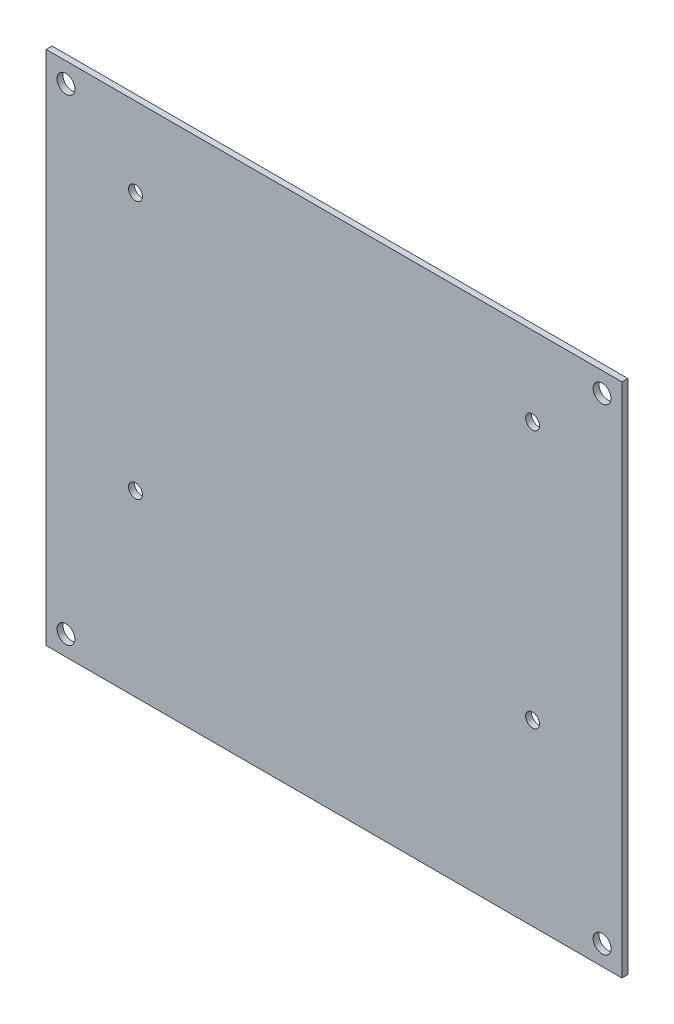
ISO-10303-21;
HEADER;
FILE_DESCRIPTION(('STEP AP214'),'2;1');
FILE_NAME('part.step','',(''),(''),'','','');
FILE_SCHEMA(('AUTOMOTIVE_DESIGN { 1 0 10303 214 1 1 1 1 }'));
ENDSEC;
DATA;
#1=APPLICATION_CONTEXT('core data for automotive mechanical design processes');
#2=APPLICATION_PROTOCOL_DEFINITION('international standard','automotive_design',2000,#1);
#3=PRODUCT_CONTEXT('',#1,'mechanical');
#4=PRODUCT('Part','Part','',(#3));
#5=PRODUCT_RELATED_PRODUCT_CATEGORY('part','',(#4));
#6=PRODUCT_DEFINITION_FORMATION('','',#4);
#7=PRODUCT_DEFINITION_CONTEXT('part definition',#1,'design');
#8=PRODUCT_DEFINITION('design','',#6,#7);
#9=PRODUCT_DEFINITION_SHAPE('','',#8);
#10=(LENGTH_UNIT() NAMED_UNIT(*) SI_UNIT(.MILLI.,.METRE.));
#11=(NAMED_UNIT(*) PLANE_ANGLE_UNIT() SI_UNIT($,.RADIAN.));
#12=(NAMED_UNIT(*) SI_UNIT($,.STERADIAN.) SOLID_ANGLE_UNIT());
#13=UNCERTAINTY_MEASURE_WITH_UNIT(LENGTH_MEASURE(1.E-05),#10,'distance_accuracy_value','');
#14=(GEOMETRIC_REPRESENTATION_CONTEXT(3) GLOBAL_UNCERTAINTY_ASSIGNED_CONTEXT((#13)) GLOBAL_UNIT_ASSIGNED_CONTEXT((#10,
#11,#12)) REPRESENTATION_CONTEXT('',''));
#15=CARTESIAN_POINT('',(0.,0.,0.));
#16=DIRECTION('',(0.,0.,1.));
#17=DIRECTION('',(1.,0.,0.));
#18=AXIS2_PLACEMENT_3D('',#15,#16,#17);
#19=CARTESIAN_POINT('',(-72.5,-65.,1.5));
#20=DIRECTION('',(0.,0.,-1.));
#21=DIRECTION('',(-1.,0.,0.));
#22=AXIS2_PLACEMENT_3D('',#19,#20,#21);
#23=PLANE('',#22);
#24=CARTESIAN_POINT('',(50.,45.,1.5));
#25=DIRECTION('',(0.,0.,1.));
#26=DIRECTION('',(1.,0.,0.));
#27=AXIS2_PLACEMENT_3D('',#24,#25,#26);
#28=CIRCLE('',#27,1.75);
#29=CARTESIAN_POINT('',(51.75,45.,1.5));
#30=VERTEX_POINT('',#29);
#31=EDGE_CURVE('E143',#30,#30,#28,.T.);
#32=ORIENTED_EDGE('',*,*,#31,.F.);
#33=EDGE_LOOP('',(#32));
#34=FACE_BOUND('',#33,.T.);
#35=CARTESIAN_POINT('',(-50.,45.,1.5));
#36=DIRECTION('',(0.,0.,1.));
#37=DIRECTION('',(1.,0.,0.));
#38=AXIS2_PLACEMENT_3D('',#35,#36,#37);
#39=CIRCLE('',#38,1.75);
#40=CARTESIAN_POINT('',(-48.25,45.,1.5));
#41=VERTEX_POINT('',#40);
#42=EDGE_CURVE('E131',#41,#41,#39,.T.);
#43=ORIENTED_EDGE('',*,*,#42,.F.);
#44=EDGE_LOOP('',(#43));
#45=FACE_BOUND('',#44,.T.);
#46=CARTESIAN_POINT('',(67.5,-60.,1.5));
#47=DIRECTION('',(0.,0.,1.));
#48=DIRECTION('',(1.,0.,0.));
#49=AXIS2_PLACEMENT_3D('',#46,#47,#48);
#50=CIRCLE('',#49,2.25);
#51=CARTESIAN_POINT('',(69.75,-60.,1.5));
#52=VERTEX_POINT('',#51);
#53=EDGE_CURVE('E119',#52,#52,#50,.T.);
#54=ORIENTED_EDGE('',*,*,#53,.F.);
#55=EDGE_LOOP('',(#54));
#56=FACE_BOUND('',#55,.T.);
#57=CARTESIAN_POINT('',(-67.5,60.,1.5));
#58=DIRECTION('',(0.,0.,1.));
#59=DIRECTION('',(1.,0.,0.));
#60=AXIS2_PLACEMENT_3D('',#57,#58,#59);
#61=CIRCLE('',#60,2.25);
#62=CARTESIAN_POINT('',(-65.25,60.,1.5));
#63=VERTEX_POINT('',#62);
#64=EDGE_CURVE('E98',#63,#63,#61,.T.);
#65=ORIENTED_EDGE('',*,*,#64,.F.);
#66=EDGE_LOOP('',(#65));
#67=FACE_BOUND('',#66,.T.);
#68=DIRECTION('',(0.,-1.,0.));
#69=VECTOR('',#68,1.);
#70=CARTESIAN_POINT('',(-72.5,-65.,1.5));
#71=LINE('',#70,#69);
#72=CARTESIAN_POINT('',(-72.5,65.,1.5));
#73=VERTEX_POINT('',#72);
#74=CARTESIAN_POINT('',(-72.5,-65.,1.5));
#75=VERTEX_POINT('',#74);
#76=EDGE_CURVE('E83',#73,#75,#71,.T.);
#77=ORIENTED_EDGE('',*,*,#76,.T.);
#78=DIRECTION('',(1.,0.,0.));
#79=VECTOR('',#78,1.);
#80=CARTESIAN_POINT('',(-72.5,-65.,1.5));
#81=LINE('',#80,#79);
#82=CARTESIAN_POINT('',(72.5,-65.,1.5));
#83=VERTEX_POINT('',#82);
#84=EDGE_CURVE('E78',#75,#83,#81,.T.);
#85=ORIENTED_EDGE('',*,*,#84,.T.);
#86=DIRECTION('',(0.,1.,0.));
#87=VECTOR('',#86,1.);
#88=CARTESIAN_POINT('',(72.5,-65.,1.5));
#89=LINE('',#88,#87);
#90=CARTESIAN_POINT('',(72.5,65.,1.5));
#91=VERTEX_POINT('',#90);
#92=EDGE_CURVE('E81',#83,#91,#89,.T.);
#93=ORIENTED_EDGE('',*,*,#92,.T.);
#94=DIRECTION('',(-1.,0.,0.));
#95=VECTOR('',#94,1.);
#96=CARTESIAN_POINT('',(-72.5,65.,1.5));
#97=LINE('',#96,#95);
#98=EDGE_CURVE('E48',#91,#73,#97,.T.);
#99=ORIENTED_EDGE('',*,*,#98,.T.);
#100=EDGE_LOOP('',(#77,#85,#93,#99));
#101=FACE_BOUND('',#100,.T.);
#102=CARTESIAN_POINT('',(-67.5,-60.,1.5));
#103=DIRECTION('',(0.,0.,1.));
#104=DIRECTION('',(-1.,0.,0.));
#105=AXIS2_PLACEMENT_3D('',#102,#103,#104);
#106=CIRCLE('',#105,2.25);
#107=CARTESIAN_POINT('',(-69.75,-60.,1.5));
#108=VERTEX_POINT('',#107);
#109=EDGE_CURVE('E113',#108,#108,#106,.T.);
#110=ORIENTED_EDGE('',*,*,#109,.F.);
#111=EDGE_LOOP('',(#110));
#112=FACE_BOUND('',#111,.T.);
#113=CARTESIAN_POINT('',(67.5,60.,1.5));
#114=DIRECTION('',(0.,0.,1.));
#115=DIRECTION('',(-1.,0.,0.));
#116=AXIS2_PLACEMENT_3D('',#113,#114,#115);
#117=CIRCLE('',#116,2.25);
#118=CARTESIAN_POINT('',(65.25,60.,1.5));
#119=VERTEX_POINT('',#118);
#120=EDGE_CURVE('E125',#119,#119,#117,.T.);
#121=ORIENTED_EDGE('',*,*,#120,.F.);
#122=EDGE_LOOP('',(#121));
#123=FACE_BOUND('',#122,.T.);
#124=CARTESIAN_POINT('',(-50.,-20.,1.5));
#125=DIRECTION('',(0.,0.,1.));
#126=DIRECTION('',(-1.,0.,0.));
#127=AXIS2_PLACEMENT_3D('',#124,#125,#126);
#128=CIRCLE('',#127,1.75);
#129=CARTESIAN_POINT('',(-51.75,-20.,1.5));
#130=VERTEX_POINT('',#129);
#131=EDGE_CURVE('E137',#130,#130,#128,.T.);
#132=ORIENTED_EDGE('',*,*,#131,.F.);
#133=EDGE_LOOP('',(#132));
#134=FACE_BOUND('',#133,.T.);
#135=CARTESIAN_POINT('',(50.,-20.,1.5));
#136=DIRECTION('',(0.,0.,1.));
#137=DIRECTION('',(-1.,0.,0.));
#138=AXIS2_PLACEMENT_3D('',#135,#136,#137);
#139=CIRCLE('',#138,1.75);
#140=CARTESIAN_POINT('',(48.25,-20.,1.5));
#141=VERTEX_POINT('',#140);
#142=EDGE_CURVE('E149',#141,#141,#139,.T.);
#143=ORIENTED_EDGE('',*,*,#142,.F.);
#144=EDGE_LOOP('',(#143));
#145=FACE_BOUND('',#144,.T.);
#146=ADVANCED_FACE('F31',(#34,#45,#56,#67,#101,#112,#123,#134,#145),#23,.F.);
#147=CARTESIAN_POINT('',(-72.5,-65.,0.));
#148=DIRECTION('',(0.,0.,-1.));
#149=DIRECTION('',(-1.,0.,0.));
#150=AXIS2_PLACEMENT_3D('',#147,#148,#149);
#151=PLANE('',#150);
#152=CARTESIAN_POINT('',(50.,45.,0.));
#153=DIRECTION('',(0.,0.,1.));
#154=DIRECTION('',(1.,0.,0.));
#155=AXIS2_PLACEMENT_3D('',#152,#153,#154);
#156=CIRCLE('',#155,1.75);
#157=CARTESIAN_POINT('',(51.75,45.,0.));
#158=VERTEX_POINT('',#157);
#159=EDGE_CURVE('E146',#158,#158,#156,.T.);
#160=ORIENTED_EDGE('',*,*,#159,.T.);
#161=EDGE_LOOP('',(#160));
#162=FACE_BOUND('',#161,.T.);
#163=CARTESIAN_POINT('',(-50.,45.,0.));
#164=DIRECTION('',(0.,0.,1.));
#165=DIRECTION('',(1.,0.,0.));
#166=AXIS2_PLACEMENT_3D('',#163,#164,#165);
#167=CIRCLE('',#166,1.75);
#168=CARTESIAN_POINT('',(-48.25,45.,0.));
#169=VERTEX_POINT('',#168);
#170=EDGE_CURVE('E134',#169,#169,#167,.T.);
#171=ORIENTED_EDGE('',*,*,#170,.T.);
#172=EDGE_LOOP('',(#171));
#173=FACE_BOUND('',#172,.T.);
#174=CARTESIAN_POINT('',(67.5,-60.,0.));
#175=DIRECTION('',(0.,0.,1.));
#176=DIRECTION('',(1.,0.,0.));
#177=AXIS2_PLACEMENT_3D('',#174,#175,#176);
#178=CIRCLE('',#177,2.25);
#179=CARTESIAN_POINT('',(69.75,-60.,0.));
#180=VERTEX_POINT('',#179);
#181=EDGE_CURVE('E122',#180,#180,#178,.T.);
#182=ORIENTED_EDGE('',*,*,#181,.T.);
#183=EDGE_LOOP('',(#182));
#184=FACE_BOUND('',#183,.T.);
#185=CARTESIAN_POINT('',(-67.5,60.,0.));
#186=DIRECTION('',(0.,0.,1.));
#187=DIRECTION('',(1.,0.,0.));
#188=AXIS2_PLACEMENT_3D('',#185,#186,#187);
#189=CIRCLE('',#188,2.25);
#190=CARTESIAN_POINT('',(-65.25,60.,0.));
#191=VERTEX_POINT('',#190);
#192=EDGE_CURVE('E110',#191,#191,#189,.T.);
#193=ORIENTED_EDGE('',*,*,#192,.T.);
#194=EDGE_LOOP('',(#193));
#195=FACE_BOUND('',#194,.T.);
#196=DIRECTION('',(0.,-1.,0.));
#197=VECTOR('',#196,1.);
#198=CARTESIAN_POINT('',(-72.5,-65.,0.));
#199=LINE('',#198,#197);
#200=CARTESIAN_POINT('',(-72.5,65.,0.));
#201=VERTEX_POINT('',#200);
#202=CARTESIAN_POINT('',(-72.5,-65.,0.));
#203=VERTEX_POINT('',#202);
#204=EDGE_CURVE('E95',#201,#203,#199,.T.);
#205=ORIENTED_EDGE('',*,*,#204,.F.);
#206=DIRECTION('',(-1.,0.,0.));
#207=VECTOR('',#206,1.);
#208=CARTESIAN_POINT('',(-72.5,65.,0.));
#209=LINE('',#208,#207);
#210=CARTESIAN_POINT('',(72.5,65.,0.));
#211=VERTEX_POINT('',#210);
#212=EDGE_CURVE('E71',#211,#201,#209,.T.);
#213=ORIENTED_EDGE('',*,*,#212,.F.);
#214=DIRECTION('',(0.,1.,0.));
#215=VECTOR('',#214,1.);
#216=CARTESIAN_POINT('',(72.5,-65.,0.));
#217=LINE('',#216,#215);
#218=CARTESIAN_POINT('',(72.5,-65.,0.));
#219=VERTEX_POINT('',#218);
#220=EDGE_CURVE('E65',#219,#211,#217,.T.);
#221=ORIENTED_EDGE('',*,*,#220,.F.);
#222=DIRECTION('',(1.,0.,0.));
#223=VECTOR('',#222,1.);
#224=CARTESIAN_POINT('',(-72.5,-65.,0.));
#225=LINE('',#224,#223);
#226=EDGE_CURVE('E87',#203,#219,#225,.T.);
#227=ORIENTED_EDGE('',*,*,#226,.F.);
#228=EDGE_LOOP('',(#205,#213,#221,#227));
#229=FACE_BOUND('',#228,.T.);
#230=CARTESIAN_POINT('',(-67.5,-60.,0.));
#231=DIRECTION('',(0.,0.,1.));
#232=DIRECTION('',(-1.,0.,0.));
#233=AXIS2_PLACEMENT_3D('',#230,#231,#232);
#234=CIRCLE('',#233,2.25);
#235=CARTESIAN_POINT('',(-69.75,-60.,0.));
#236=VERTEX_POINT('',#235);
#237=EDGE_CURVE('E116',#236,#236,#234,.T.);
#238=ORIENTED_EDGE('',*,*,#237,.T.);
#239=EDGE_LOOP('',(#238));
#240=FACE_BOUND('',#239,.T.);
#241=CARTESIAN_POINT('',(67.5,60.,0.));
#242=DIRECTION('',(0.,0.,1.));
#243=DIRECTION('',(-1.,0.,0.));
#244=AXIS2_PLACEMENT_3D('',#241,#242,#243);
#245=CIRCLE('',#244,2.25);
#246=CARTESIAN_POINT('',(65.25,60.,0.));
#247=VERTEX_POINT('',#246);
#248=EDGE_CURVE('E128',#247,#247,#245,.T.);
#249=ORIENTED_EDGE('',*,*,#248,.T.);
#250=EDGE_LOOP('',(#249));
#251=FACE_BOUND('',#250,.T.);
#252=CARTESIAN_POINT('',(-50.,-20.,0.));
#253=DIRECTION('',(0.,0.,1.));
#254=DIRECTION('',(-1.,0.,0.));
#255=AXIS2_PLACEMENT_3D('',#252,#253,#254);
#256=CIRCLE('',#255,1.75);
#257=CARTESIAN_POINT('',(-51.75,-20.,0.));
#258=VERTEX_POINT('',#257);
#259=EDGE_CURVE('E140',#258,#258,#256,.T.);
#260=ORIENTED_EDGE('',*,*,#259,.T.);
#261=EDGE_LOOP('',(#260));
#262=FACE_BOUND('',#261,.T.);
#263=CARTESIAN_POINT('',(50.,-20.,0.));
#264=DIRECTION('',(0.,0.,1.));
#265=DIRECTION('',(-1.,0.,0.));
#266=AXIS2_PLACEMENT_3D('',#263,#264,#265);
#267=CIRCLE('',#266,1.75);
#268=CARTESIAN_POINT('',(48.25,-20.,0.));
#269=VERTEX_POINT('',#268);
#270=EDGE_CURVE('E152',#269,#269,#267,.T.);
#271=ORIENTED_EDGE('',*,*,#270,.T.);
#272=EDGE_LOOP('',(#271));
#273=FACE_BOUND('',#272,.T.);
#274=ADVANCED_FACE('F106',(#162,#173,#184,#195,#229,#240,#251,#262,#273),#151,.T.);
#275=CARTESIAN_POINT('',(-72.5,-65.,1.5));
#276=DIRECTION('',(1.,0.,0.));
#277=DIRECTION('',(0.,1.,0.));
#278=AXIS2_PLACEMENT_3D('',#275,#276,#277);
#279=PLANE('',#278);
#280=ORIENTED_EDGE('',*,*,#204,.T.);
#281=DIRECTION('',(0.,0.,-1.));
#282=VECTOR('',#281,1.);
#283=CARTESIAN_POINT('',(-72.5,-65.,1.5));
#284=LINE('',#283,#282);
#285=EDGE_CURVE('E11',#75,#203,#284,.T.);
#286=ORIENTED_EDGE('',*,*,#285,.F.);
#287=ORIENTED_EDGE('',*,*,#76,.F.);
#288=DIRECTION('',(0.,0.,-1.));
#289=VECTOR('',#288,1.);
#290=CARTESIAN_POINT('',(-72.5,65.,1.5));
#291=LINE('',#290,#289);
#292=EDGE_CURVE('E91',#73,#201,#291,.T.);
#293=ORIENTED_EDGE('',*,*,#292,.T.);
#294=EDGE_LOOP('',(#280,#286,#287,#293));
#295=FACE_BOUND('',#294,.T.);
#296=ADVANCED_FACE('F33',(#295),#279,.F.);
#297=CARTESIAN_POINT('',(-72.5,-65.,1.5));
#298=DIRECTION('',(0.,1.,0.));
#299=DIRECTION('',(-1.,0.,0.));
#300=AXIS2_PLACEMENT_3D('',#297,#298,#299);
#301=PLANE('',#300);
#302=ORIENTED_EDGE('',*,*,#226,.T.);
#303=DIRECTION('',(0.,0.,-1.));
#304=VECTOR('',#303,1.);
#305=CARTESIAN_POINT('',(72.5,-65.,1.5));
#306=LINE('',#305,#304);
#307=EDGE_CURVE('E40',#83,#219,#306,.T.);
#308=ORIENTED_EDGE('',*,*,#307,.F.);
#309=ORIENTED_EDGE('',*,*,#84,.F.);
#310=ORIENTED_EDGE('',*,*,#285,.T.);
#311=EDGE_LOOP('',(#302,#308,#309,#310));
#312=FACE_BOUND('',#311,.T.);
#313=ADVANCED_FACE('F86',(#312),#301,.F.);
#314=CARTESIAN_POINT('',(72.5,-65.,1.5));
#315=DIRECTION('',(-1.,0.,0.));
#316=DIRECTION('',(0.,-1.,0.));
#317=AXIS2_PLACEMENT_3D('',#314,#315,#316);
#318=PLANE('',#317);
#319=ORIENTED_EDGE('',*,*,#220,.T.);
#320=DIRECTION('',(0.,0.,-1.));
#321=VECTOR('',#320,1.);
#322=CARTESIAN_POINT('',(72.5,65.,1.5));
#323=LINE('',#322,#321);
#324=EDGE_CURVE('E88',#91,#211,#323,.T.);
#325=ORIENTED_EDGE('',*,*,#324,.F.);
#326=ORIENTED_EDGE('',*,*,#92,.F.);
#327=ORIENTED_EDGE('',*,*,#307,.T.);
#328=EDGE_LOOP('',(#319,#325,#326,#327));
#329=FACE_BOUND('',#328,.T.);
#330=ADVANCED_FACE('F89',(#329),#318,.F.);
#331=CARTESIAN_POINT('',(-72.5,65.,1.5));
#332=DIRECTION('',(0.,-1.,0.));
#333=DIRECTION('',(0.,0.,-1.));
#334=AXIS2_PLACEMENT_3D('',#331,#332,#333);
#335=PLANE('',#334);
#336=ORIENTED_EDGE('',*,*,#212,.T.);
#337=ORIENTED_EDGE('',*,*,#292,.F.);
#338=ORIENTED_EDGE('',*,*,#98,.F.);
#339=ORIENTED_EDGE('',*,*,#324,.T.);
#340=EDGE_LOOP('',(#336,#337,#338,#339));
#341=FACE_BOUND('',#340,.T.);
#342=ADVANCED_FACE('F103',(#341),#335,.F.);
#343=CARTESIAN_POINT('',(-67.5,60.,1.5));
#344=DIRECTION('',(0.,0.,-1.));
#345=DIRECTION('',(-1.,0.,0.));
#346=AXIS2_PLACEMENT_3D('',#343,#344,#345);
#347=CYLINDRICAL_SURFACE('',#346,2.25);
#348=ORIENTED_EDGE('',*,*,#64,.T.);
#349=EDGE_LOOP('',(#348));
#350=FACE_BOUND('',#349,.T.);
#351=ORIENTED_EDGE('',*,*,#192,.F.);
#352=EDGE_LOOP('',(#351));
#353=FACE_BOUND('',#352,.T.);
#354=ADVANCED_FACE('F172',(#350,#353),#347,.F.);
#355=CARTESIAN_POINT('',(-67.5,-60.,1.5));
#356=DIRECTION('',(0.,0.,-1.));
#357=DIRECTION('',(-1.,0.,0.));
#358=AXIS2_PLACEMENT_3D('',#355,#356,#357);
#359=CYLINDRICAL_SURFACE('',#358,2.25);
#360=ORIENTED_EDGE('',*,*,#109,.T.);
#361=EDGE_LOOP('',(#360));
#362=FACE_BOUND('',#361,.T.);
#363=ORIENTED_EDGE('',*,*,#237,.F.);
#364=EDGE_LOOP('',(#363));
#365=FACE_BOUND('',#364,.T.);
#366=ADVANCED_FACE('F218',(#362,#365),#359,.F.);
#367=CARTESIAN_POINT('',(67.5,-60.,1.5));
#368=DIRECTION('',(0.,0.,-1.));
#369=DIRECTION('',(-1.,0.,0.));
#370=AXIS2_PLACEMENT_3D('',#367,#368,#369);
#371=CYLINDRICAL_SURFACE('',#370,2.25);
#372=ORIENTED_EDGE('',*,*,#53,.T.);
#373=EDGE_LOOP('',(#372));
#374=FACE_BOUND('',#373,.T.);
#375=ORIENTED_EDGE('',*,*,#181,.F.);
#376=EDGE_LOOP('',(#375));
#377=FACE_BOUND('',#376,.T.);
#378=ADVANCED_FACE('F226',(#374,#377),#371,.F.);
#379=CARTESIAN_POINT('',(67.5,60.,1.5));
#380=DIRECTION('',(0.,0.,-1.));
#381=DIRECTION('',(-1.,0.,0.));
#382=AXIS2_PLACEMENT_3D('',#379,#380,#381);
#383=CYLINDRICAL_SURFACE('',#382,2.25);
#384=ORIENTED_EDGE('',*,*,#120,.T.);
#385=EDGE_LOOP('',(#384));
#386=FACE_BOUND('',#385,.T.);
#387=ORIENTED_EDGE('',*,*,#248,.F.);
#388=EDGE_LOOP('',(#387));
#389=FACE_BOUND('',#388,.T.);
#390=ADVANCED_FACE('F234',(#386,#389),#383,.F.);
#391=CARTESIAN_POINT('',(-50.,45.,1.5));
#392=DIRECTION('',(0.,0.,-1.));
#393=DIRECTION('',(-1.,0.,0.));
#394=AXIS2_PLACEMENT_3D('',#391,#392,#393);
#395=CYLINDRICAL_SURFACE('',#394,1.75);
#396=ORIENTED_EDGE('',*,*,#42,.T.);
#397=EDGE_LOOP('',(#396));
#398=FACE_BOUND('',#397,.T.);
#399=ORIENTED_EDGE('',*,*,#170,.F.);
#400=EDGE_LOOP('',(#399));
#401=FACE_BOUND('',#400,.T.);
#402=ADVANCED_FACE('F243',(#398,#401),#395,.F.);
#403=CARTESIAN_POINT('',(-50.,-20.,1.5));
#404=DIRECTION('',(0.,0.,-1.));
#405=DIRECTION('',(-1.,0.,0.));
#406=AXIS2_PLACEMENT_3D('',#403,#404,#405);
#407=CYLINDRICAL_SURFACE('',#406,1.75);
#408=ORIENTED_EDGE('',*,*,#131,.T.);
#409=EDGE_LOOP('',(#408));
#410=FACE_BOUND('',#409,.T.);
#411=ORIENTED_EDGE('',*,*,#259,.F.);
#412=EDGE_LOOP('',(#411));
#413=FACE_BOUND('',#412,.T.);
#414=ADVANCED_FACE('F252',(#410,#413),#407,.F.);
#415=CARTESIAN_POINT('',(50.,45.,1.5));
#416=DIRECTION('',(0.,0.,-1.));
#417=DIRECTION('',(-1.,0.,0.));
#418=AXIS2_PLACEMENT_3D('',#415,#416,#417);
#419=CYLINDRICAL_SURFACE('',#418,1.75);
#420=ORIENTED_EDGE('',*,*,#31,.T.);
#421=EDGE_LOOP('',(#420));
#422=FACE_BOUND('',#421,.T.);
#423=ORIENTED_EDGE('',*,*,#159,.F.);
#424=EDGE_LOOP('',(#423));
#425=FACE_BOUND('',#424,.T.);
#426=ADVANCED_FACE('F261',(#422,#425),#419,.F.);
#427=CARTESIAN_POINT('',(50.,-20.,1.5));
#428=DIRECTION('',(0.,0.,-1.));
#429=DIRECTION('',(-1.,0.,0.));
#430=AXIS2_PLACEMENT_3D('',#427,#428,#429);
#431=CYLINDRICAL_SURFACE('',#430,1.75);
#432=ORIENTED_EDGE('',*,*,#142,.T.);
#433=EDGE_LOOP('',(#432));
#434=FACE_BOUND('',#433,.T.);
#435=ORIENTED_EDGE('',*,*,#270,.F.);
#436=EDGE_LOOP('',(#435));
#437=FACE_BOUND('',#436,.T.);
#438=ADVANCED_FACE('F158',(#434,#437),#431,.F.);
#439=CLOSED_SHELL('',(#146,#274,#296,#313,#330,#342,#354,#366,#378,#390,#402,#414,#426,#438));
#440=MANIFOLD_SOLID_BREP('B2',#439);
#441=ADVANCED_BREP_SHAPE_REPRESENTATION('',(#18,#440),#14);
#442=SHAPE_DEFINITION_REPRESENTATION(#9,#441);
ENDSEC;
END-ISO-10303-21;
